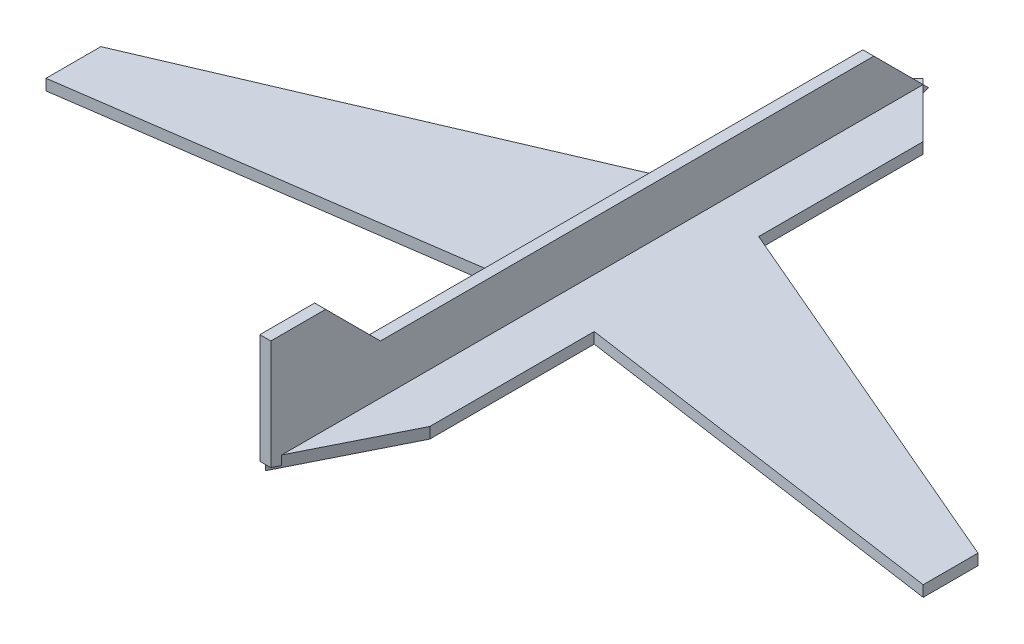
ISO-10303-21;
HEADER;
FILE_DESCRIPTION(('STEP AP214'),'2;1');
FILE_NAME('part.step','',(''),(''),'','','');
FILE_SCHEMA(('AUTOMOTIVE_DESIGN { 1 0 10303 214 1 1 1 1 }'));
ENDSEC;
DATA;
#1=APPLICATION_CONTEXT('core data for automotive mechanical design processes');
#2=APPLICATION_PROTOCOL_DEFINITION('international standard','automotive_design',2000,#1);
#3=PRODUCT_CONTEXT('',#1,'mechanical');
#4=PRODUCT('Part','Part','',(#3));
#5=PRODUCT_RELATED_PRODUCT_CATEGORY('part','',(#4));
#6=PRODUCT_DEFINITION_FORMATION('','',#4);
#7=PRODUCT_DEFINITION_CONTEXT('part definition',#1,'design');
#8=PRODUCT_DEFINITION('design','',#6,#7);
#9=PRODUCT_DEFINITION_SHAPE('','',#8);
#10=(LENGTH_UNIT() NAMED_UNIT(*) SI_UNIT(.MILLI.,.METRE.));
#11=(NAMED_UNIT(*) PLANE_ANGLE_UNIT() SI_UNIT($,.RADIAN.));
#12=(NAMED_UNIT(*) SI_UNIT($,.STERADIAN.) SOLID_ANGLE_UNIT());
#13=UNCERTAINTY_MEASURE_WITH_UNIT(LENGTH_MEASURE(1.E-05),#10,'distance_accuracy_value','');
#14=(GEOMETRIC_REPRESENTATION_CONTEXT(3) GLOBAL_UNCERTAINTY_ASSIGNED_CONTEXT((#13)) GLOBAL_UNIT_ASSIGNED_CONTEXT((#10,
#11,#12)) REPRESENTATION_CONTEXT('',''));
#15=CARTESIAN_POINT('',(0.,0.,0.));
#16=DIRECTION('',(0.,0.,1.));
#17=DIRECTION('',(1.,0.,0.));
#18=AXIS2_PLACEMENT_3D('',#15,#16,#17);
#19=CARTESIAN_POINT('',(-2.5,-0.1,-2.5));
#20=DIRECTION('',(-0.707106781186548,0.,-0.707106781186547));
#21=DIRECTION('',(-0.707106781186547,0.,0.707106781186548));
#22=AXIS2_PLACEMENT_3D('',#19,#20,#21);
#23=PLANE('',#22);
#24=DIRECTION('',(-0.688247201611685,-0.229415733870562,0.688247201611686));
#25=VECTOR('',#24,1.);
#26=CARTESIAN_POINT('',(-2.38421052631579,-0.794736842105264,-2.61578947368421));
#27=LINE('',#26,#25);
#28=CARTESIAN_POINT('',(0.,0.,-5.));
#29=VERTEX_POINT('',#28);
#30=CARTESIAN_POINT('',(-0.0999999999999999,-0.0333333333333336,-4.9));
#31=VERTEX_POINT('',#30);
#32=EDGE_CURVE('E334',#29,#31,#27,.T.);
#33=ORIENTED_EDGE('',*,*,#32,.F.);
#34=DIRECTION('',(0.,1.,0.));
#35=VECTOR('',#34,1.);
#36=CARTESIAN_POINT('',(0.,-0.1,-5.));
#37=LINE('',#36,#35);
#38=CARTESIAN_POINT('',(0.,-0.1,-5.));
#39=VERTEX_POINT('',#38);
#40=EDGE_CURVE('E50',#39,#29,#37,.T.);
#41=ORIENTED_EDGE('',*,*,#40,.F.);
#42=DIRECTION('',(-0.707106781186547,0.,0.707106781186548));
#43=VECTOR('',#42,1.);
#44=CARTESIAN_POINT('',(-2.5,-0.1,-2.5));
#45=LINE('',#44,#43);
#46=CARTESIAN_POINT('',(-0.999999999999999,-0.1,-4.));
#47=VERTEX_POINT('',#46);
#48=EDGE_CURVE('E379',#39,#47,#45,.T.);
#49=ORIENTED_EDGE('',*,*,#48,.T.);
#50=DIRECTION('',(0.,1.,0.));
#51=VECTOR('',#50,1.);
#52=CARTESIAN_POINT('',(-0.999999999999999,-0.1,-4.));
#53=LINE('',#52,#51);
#54=CARTESIAN_POINT('',(-0.999999999999999,0.1,-4.));
#55=VERTEX_POINT('',#54);
#56=EDGE_CURVE('E432',#47,#55,#53,.T.);
#57=ORIENTED_EDGE('',*,*,#56,.T.);
#58=DIRECTION('',(-0.707106781186547,0.,0.707106781186548));
#59=VECTOR('',#58,1.);
#60=CARTESIAN_POINT('',(-2.5,0.1,-2.5));
#61=LINE('',#60,#59);
#62=CARTESIAN_POINT('',(-0.1,0.1,-4.9));
#63=VERTEX_POINT('',#62);
#64=EDGE_CURVE('E343',#63,#55,#61,.T.);
#65=ORIENTED_EDGE('',*,*,#64,.F.);
#66=DIRECTION('',(0.,-1.,0.));
#67=VECTOR('',#66,1.);
#68=CARTESIAN_POINT('',(-0.0999999999999998,-0.1,-4.9));
#69=LINE('',#68,#67);
#70=EDGE_CURVE('E316',#63,#31,#69,.T.);
#71=ORIENTED_EDGE('',*,*,#70,.T.);
#72=EDGE_LOOP('',(#33,#41,#49,#57,#65,#71));
#73=FACE_BOUND('',#72,.T.);
#74=ADVANCED_FACE('F35',(#73),#23,.T.);
#75=CARTESIAN_POINT('',(2.5,-0.1,-2.5));
#76=DIRECTION('',(-0.707106781186548,0.,0.707106781186547));
#77=DIRECTION('',(0.707106781186547,0.,0.707106781186548));
#78=AXIS2_PLACEMENT_3D('',#75,#76,#77);
#79=PLANE('',#78);
#80=ORIENTED_EDGE('',*,*,#40,.T.);
#81=DIRECTION('',(0.688247201611685,-0.229415733870562,0.688247201611686));
#82=VECTOR('',#81,1.);
#83=CARTESIAN_POINT('',(2.38421052631579,-0.794736842105264,-2.61578947368421));
#84=LINE('',#83,#82);
#85=CARTESIAN_POINT('',(0.0999999999999999,-0.0333333333333336,-4.9));
#86=VERTEX_POINT('',#85);
#87=EDGE_CURVE('E230',#29,#86,#84,.T.);
#88=ORIENTED_EDGE('',*,*,#87,.T.);
#89=DIRECTION('',(0.,1.,0.));
#90=VECTOR('',#89,1.);
#91=CARTESIAN_POINT('',(0.0999999999999998,-0.1,-4.9));
#92=LINE('',#91,#90);
#93=CARTESIAN_POINT('',(0.1,0.1,-4.9));
#94=VERTEX_POINT('',#93);
#95=EDGE_CURVE('E240',#86,#94,#92,.T.);
#96=ORIENTED_EDGE('',*,*,#95,.T.);
#97=DIRECTION('',(0.707106781186547,0.,0.707106781186548));
#98=VECTOR('',#97,1.);
#99=CARTESIAN_POINT('',(2.5,0.1,-2.5));
#100=LINE('',#99,#98);
#101=CARTESIAN_POINT('',(1.,0.1,-4.));
#102=VERTEX_POINT('',#101);
#103=EDGE_CURVE('E339',#94,#102,#100,.T.);
#104=ORIENTED_EDGE('',*,*,#103,.T.);
#105=DIRECTION('',(0.,1.,0.));
#106=VECTOR('',#105,1.);
#107=CARTESIAN_POINT('',(1.,-0.1,-4.));
#108=LINE('',#107,#106);
#109=CARTESIAN_POINT('',(1.,-0.1,-4.));
#110=VERTEX_POINT('',#109);
#111=EDGE_CURVE('E405',#110,#102,#108,.T.);
#112=ORIENTED_EDGE('',*,*,#111,.F.);
#113=DIRECTION('',(0.707106781186547,0.,0.707106781186548));
#114=VECTOR('',#113,1.);
#115=CARTESIAN_POINT('',(2.5,-0.1,-2.5));
#116=LINE('',#115,#114);
#117=EDGE_CURVE('E376',#39,#110,#116,.T.);
#118=ORIENTED_EDGE('',*,*,#117,.F.);
#119=EDGE_LOOP('',(#80,#88,#96,#104,#112,#118));
#120=FACE_BOUND('',#119,.T.);
#121=ADVANCED_FACE('F488',(#120),#79,.F.);
#122=CARTESIAN_POINT('',(0.,-0.1,0.));
#123=DIRECTION('',(0.,1.,0.));
#124=DIRECTION('',(0.,0.,1.));
#125=AXIS2_PLACEMENT_3D('',#122,#123,#124);
#126=PLANE('',#125);
#127=DIRECTION('',(0.,0.,1.));
#128=VECTOR('',#127,1.);
#129=CARTESIAN_POINT('',(1.,-0.1,0.));
#130=LINE('',#129,#128);
#131=CARTESIAN_POINT('',(1.,-0.1,-1.));
#132=VERTEX_POINT('',#131);
#133=EDGE_CURVE('E373',#110,#132,#130,.T.);
#134=ORIENTED_EDGE('',*,*,#133,.T.);
#135=DIRECTION('',(0.919145030018058,0.,0.393919298579168));
#136=VECTOR('',#135,1.);
#137=CARTESIAN_POINT('',(0.517241379310345,-0.1,-1.20689655172414));
#138=LINE('',#137,#136);
#139=CARTESIAN_POINT('',(8.,-0.1,2.));
#140=VERTEX_POINT('',#139);
#141=EDGE_CURVE('E403',#132,#140,#138,.T.);
#142=ORIENTED_EDGE('',*,*,#141,.T.);
#143=DIRECTION('',(0.,0.,1.));
#144=VECTOR('',#143,1.);
#145=CARTESIAN_POINT('',(8.,-0.1,0.));
#146=LINE('',#145,#144);
#147=CARTESIAN_POINT('',(8.,-0.1,3.));
#148=VERTEX_POINT('',#147);
#149=EDGE_CURVE('E401',#140,#148,#146,.T.);
#150=ORIENTED_EDGE('',*,*,#149,.T.);
#151=DIRECTION('',(-0.989949493661167,0.,-0.14142135623731));
#152=VECTOR('',#151,1.);
#153=CARTESIAN_POINT('',(-0.26,-0.1,1.82));
#154=LINE('',#153,#152);
#155=CARTESIAN_POINT('',(1.,-0.1,2.));
#156=VERTEX_POINT('',#155);
#157=EDGE_CURVE('E399',#148,#156,#154,.T.);
#158=ORIENTED_EDGE('',*,*,#157,.T.);
#159=CARTESIAN_POINT('',(1.,-0.1,5.));
#160=VERTEX_POINT('',#159);
#161=EDGE_CURVE('E377',#156,#160,#130,.T.);
#162=ORIENTED_EDGE('',*,*,#161,.T.);
#163=DIRECTION('',(0.447213595499958,0.,-0.894427190999916));
#164=VECTOR('',#163,1.);
#165=CARTESIAN_POINT('',(2.8,-0.1,1.4));
#166=LINE('',#165,#164);
#167=CARTESIAN_POINT('',(0.,-0.1,7.));
#168=VERTEX_POINT('',#167);
#169=EDGE_CURVE('E396',#168,#160,#166,.T.);
#170=ORIENTED_EDGE('',*,*,#169,.F.);
#171=DIRECTION('',(-0.447213595499958,0.,-0.894427190999916));
#172=VECTOR('',#171,1.);
#173=CARTESIAN_POINT('',(-2.8,-0.1,1.4));
#174=LINE('',#173,#172);
#175=CARTESIAN_POINT('',(-1.,-0.1,5.));
#176=VERTEX_POINT('',#175);
#177=EDGE_CURVE('E394',#168,#176,#174,.T.);
#178=ORIENTED_EDGE('',*,*,#177,.T.);
#179=DIRECTION('',(0.,0.,-1.));
#180=VECTOR('',#179,1.);
#181=CARTESIAN_POINT('',(-1.,-0.1,0.));
#182=LINE('',#181,#180);
#183=CARTESIAN_POINT('',(-1.,-0.1,2.));
#184=VERTEX_POINT('',#183);
#185=EDGE_CURVE('E385',#176,#184,#182,.T.);
#186=ORIENTED_EDGE('',*,*,#185,.T.);
#187=DIRECTION('',(0.989949493661167,0.,-0.14142135623731));
#188=VECTOR('',#187,1.);
#189=CARTESIAN_POINT('',(0.26,-0.1,1.82));
#190=LINE('',#189,#188);
#191=CARTESIAN_POINT('',(-8.,-0.1,3.));
#192=VERTEX_POINT('',#191);
#193=EDGE_CURVE('E391',#192,#184,#190,.T.);
#194=ORIENTED_EDGE('',*,*,#193,.F.);
#195=DIRECTION('',(0.,0.,1.));
#196=VECTOR('',#195,1.);
#197=CARTESIAN_POINT('',(-8.,-0.1,0.));
#198=LINE('',#197,#196);
#199=CARTESIAN_POINT('',(-8.,-0.1,2.));
#200=VERTEX_POINT('',#199);
#201=EDGE_CURVE('E388',#200,#192,#198,.T.);
#202=ORIENTED_EDGE('',*,*,#201,.F.);
#203=DIRECTION('',(-0.919145030018058,0.,0.393919298579168));
#204=VECTOR('',#203,1.);
#205=CARTESIAN_POINT('',(-0.517241379310345,-0.1,-1.20689655172414));
#206=LINE('',#205,#204);
#207=CARTESIAN_POINT('',(-1.,-0.1,-1.));
#208=VERTEX_POINT('',#207);
#209=EDGE_CURVE('E384',#208,#200,#206,.T.);
#210=ORIENTED_EDGE('',*,*,#209,.F.);
#211=EDGE_CURVE('E382',#208,#47,#182,.T.);
#212=ORIENTED_EDGE('',*,*,#211,.T.);
#213=ORIENTED_EDGE('',*,*,#48,.F.);
#214=ORIENTED_EDGE('',*,*,#117,.T.);
#215=EDGE_LOOP('',(#134,#142,#150,#158,#162,#170,#178,#186,#194,#202,#210,#212,#213,#214));
#216=FACE_BOUND('',#215,.T.);
#217=DIRECTION('',(0.,0.,-1.));
#218=VECTOR('',#217,1.);
#219=CARTESIAN_POINT('',(-0.1,-0.1,0.));
#220=LINE('',#219,#218);
#221=CARTESIAN_POINT('',(-0.1,-0.1,6.7));
#222=VERTEX_POINT('',#221);
#223=CARTESIAN_POINT('',(-0.1,-0.1,-4.7));
#224=VERTEX_POINT('',#223);
#225=EDGE_CURVE('E322',#222,#224,#220,.T.);
#226=ORIENTED_EDGE('',*,*,#225,.F.);
#227=DIRECTION('',(1.,0.,0.));
#228=VECTOR('',#227,1.);
#229=CARTESIAN_POINT('',(0.,-0.1,6.7));
#230=LINE('',#229,#228);
#231=CARTESIAN_POINT('',(0.1,-0.1,6.7));
#232=VERTEX_POINT('',#231);
#233=EDGE_CURVE('E43',#222,#232,#230,.T.);
#234=ORIENTED_EDGE('',*,*,#233,.T.);
#235=DIRECTION('',(0.,0.,-1.));
#236=VECTOR('',#235,1.);
#237=CARTESIAN_POINT('',(0.1,-0.1,0.));
#238=LINE('',#237,#236);
#239=CARTESIAN_POINT('',(0.1,-0.1,-4.7));
#240=VERTEX_POINT('',#239);
#241=EDGE_CURVE('E313',#232,#240,#238,.T.);
#242=ORIENTED_EDGE('',*,*,#241,.T.);
#243=DIRECTION('',(-1.,0.,0.));
#244=VECTOR('',#243,1.);
#245=CARTESIAN_POINT('',(0.,-0.1,-4.7));
#246=LINE('',#245,#244);
#247=EDGE_CURVE('E11',#240,#224,#246,.T.);
#248=ORIENTED_EDGE('',*,*,#247,.T.);
#249=EDGE_LOOP('',(#226,#234,#242,#248));
#250=FACE_BOUND('',#249,.T.);
#251=ADVANCED_FACE('F449',(#216,#250),#126,.F.);
#252=CARTESIAN_POINT('',(0.,0.1,0.));
#253=DIRECTION('',(0.,1.,0.));
#254=DIRECTION('',(0.,0.,1.));
#255=AXIS2_PLACEMENT_3D('',#252,#253,#254);
#256=PLANE('',#255);
#257=DIRECTION('',(-0.447213595499958,0.,-0.894427190999916));
#258=VECTOR('',#257,1.);
#259=CARTESIAN_POINT('',(-2.8,0.1,1.4));
#260=LINE('',#259,#258);
#261=CARTESIAN_POINT('',(-0.1,0.1,6.8));
#262=VERTEX_POINT('',#261);
#263=CARTESIAN_POINT('',(-1.,0.1,5.));
#264=VERTEX_POINT('',#263);
#265=EDGE_CURVE('E360',#262,#264,#260,.T.);
#266=ORIENTED_EDGE('',*,*,#265,.F.);
#267=DIRECTION('',(0.,0.,-1.));
#268=VECTOR('',#267,1.);
#269=CARTESIAN_POINT('',(-0.1,0.1,0.));
#270=LINE('',#269,#268);
#271=EDGE_CURVE('E444',#262,#63,#270,.T.);
#272=ORIENTED_EDGE('',*,*,#271,.T.);
#273=ORIENTED_EDGE('',*,*,#64,.T.);
#274=DIRECTION('',(0.,0.,-1.));
#275=VECTOR('',#274,1.);
#276=CARTESIAN_POINT('',(-1.,0.1,0.));
#277=LINE('',#276,#275);
#278=CARTESIAN_POINT('',(-1.,0.1,-1.));
#279=VERTEX_POINT('',#278);
#280=EDGE_CURVE('E347',#279,#55,#277,.T.);
#281=ORIENTED_EDGE('',*,*,#280,.F.);
#282=DIRECTION('',(-0.919145030018058,0.,0.393919298579168));
#283=VECTOR('',#282,1.);
#284=CARTESIAN_POINT('',(-0.517241379310345,0.1,-1.20689655172414));
#285=LINE('',#284,#283);
#286=CARTESIAN_POINT('',(-8.,0.1,2.));
#287=VERTEX_POINT('',#286);
#288=EDGE_CURVE('E350',#279,#287,#285,.T.);
#289=ORIENTED_EDGE('',*,*,#288,.T.);
#290=DIRECTION('',(0.,0.,1.));
#291=VECTOR('',#290,1.);
#292=CARTESIAN_POINT('',(-8.,0.1,0.));
#293=LINE('',#292,#291);
#294=CARTESIAN_POINT('',(-8.,0.1,3.));
#295=VERTEX_POINT('',#294);
#296=EDGE_CURVE('E354',#287,#295,#293,.T.);
#297=ORIENTED_EDGE('',*,*,#296,.T.);
#298=DIRECTION('',(0.989949493661167,0.,-0.14142135623731));
#299=VECTOR('',#298,1.);
#300=CARTESIAN_POINT('',(0.26,0.1,1.82));
#301=LINE('',#300,#299);
#302=CARTESIAN_POINT('',(-1.,0.1,2.));
#303=VERTEX_POINT('',#302);
#304=EDGE_CURVE('E357',#295,#303,#301,.T.);
#305=ORIENTED_EDGE('',*,*,#304,.T.);
#306=EDGE_CURVE('E351',#264,#303,#277,.T.);
#307=ORIENTED_EDGE('',*,*,#306,.F.);
#308=EDGE_LOOP('',(#266,#272,#273,#281,#289,#297,#305,#307));
#309=FACE_BOUND('',#308,.T.);
#310=ADVANCED_FACE('F517',(#309),#256,.T.);
#311=CARTESIAN_POINT('',(1.,-0.1,0.));
#312=DIRECTION('',(-1.,0.,0.));
#313=DIRECTION('',(0.,0.,1.));
#314=AXIS2_PLACEMENT_3D('',#311,#312,#313);
#315=PLANE('',#314);
#316=ORIENTED_EDGE('',*,*,#111,.T.);
#317=DIRECTION('',(0.,0.,1.));
#318=VECTOR('',#317,1.);
#319=CARTESIAN_POINT('',(1.,0.1,0.));
#320=LINE('',#319,#318);
#321=CARTESIAN_POINT('',(1.,0.1,-1.));
#322=VERTEX_POINT('',#321);
#323=EDGE_CURVE('E336',#102,#322,#320,.T.);
#324=ORIENTED_EDGE('',*,*,#323,.T.);
#325=DIRECTION('',(0.,1.,0.));
#326=VECTOR('',#325,1.);
#327=CARTESIAN_POINT('',(1.,-0.1,-1.));
#328=LINE('',#327,#326);
#329=EDGE_CURVE('E406',#132,#322,#328,.T.);
#330=ORIENTED_EDGE('',*,*,#329,.F.);
#331=ORIENTED_EDGE('',*,*,#133,.F.);
#332=EDGE_LOOP('',(#316,#324,#330,#331));
#333=FACE_BOUND('',#332,.T.);
#334=ADVANCED_FACE('F706',(#333),#315,.F.);
#335=CARTESIAN_POINT('',(0.517241379310345,-0.1,-1.20689655172414));
#336=DIRECTION('',(-0.393919298579168,0.,0.919145030018058));
#337=DIRECTION('',(0.919145030018058,0.,0.393919298579168));
#338=AXIS2_PLACEMENT_3D('',#335,#336,#337);
#339=PLANE('',#338);
#340=ORIENTED_EDGE('',*,*,#329,.T.);
#341=DIRECTION('',(0.919145030018058,0.,0.393919298579168));
#342=VECTOR('',#341,1.);
#343=CARTESIAN_POINT('',(0.517241379310345,0.1,-1.20689655172414));
#344=LINE('',#343,#342);
#345=CARTESIAN_POINT('',(8.,0.1,2.));
#346=VERTEX_POINT('',#345);
#347=EDGE_CURVE('E370',#322,#346,#344,.T.);
#348=ORIENTED_EDGE('',*,*,#347,.T.);
#349=DIRECTION('',(0.,1.,0.));
#350=VECTOR('',#349,1.);
#351=CARTESIAN_POINT('',(8.,-0.1,2.));
#352=LINE('',#351,#350);
#353=EDGE_CURVE('E409',#140,#346,#352,.T.);
#354=ORIENTED_EDGE('',*,*,#353,.F.);
#355=ORIENTED_EDGE('',*,*,#141,.F.);
#356=EDGE_LOOP('',(#340,#348,#354,#355));
#357=FACE_BOUND('',#356,.T.);
#358=ADVANCED_FACE('F802',(#357),#339,.F.);
#359=CARTESIAN_POINT('',(8.,-0.1,0.));
#360=DIRECTION('',(-1.,0.,0.));
#361=DIRECTION('',(0.,0.,1.));
#362=AXIS2_PLACEMENT_3D('',#359,#360,#361);
#363=PLANE('',#362);
#364=ORIENTED_EDGE('',*,*,#353,.T.);
#365=DIRECTION('',(0.,0.,1.));
#366=VECTOR('',#365,1.);
#367=CARTESIAN_POINT('',(8.,0.1,0.));
#368=LINE('',#367,#366);
#369=CARTESIAN_POINT('',(8.,0.1,3.));
#370=VERTEX_POINT('',#369);
#371=EDGE_CURVE('E367',#346,#370,#368,.T.);
#372=ORIENTED_EDGE('',*,*,#371,.T.);
#373=DIRECTION('',(0.,1.,0.));
#374=VECTOR('',#373,1.);
#375=CARTESIAN_POINT('',(8.,-0.1,3.));
#376=LINE('',#375,#374);
#377=EDGE_CURVE('E411',#148,#370,#376,.T.);
#378=ORIENTED_EDGE('',*,*,#377,.F.);
#379=ORIENTED_EDGE('',*,*,#149,.F.);
#380=EDGE_LOOP('',(#364,#372,#378,#379));
#381=FACE_BOUND('',#380,.T.);
#382=ADVANCED_FACE('F791',(#381),#363,.F.);
#383=CARTESIAN_POINT('',(-0.26,-0.1,1.82));
#384=DIRECTION('',(0.141421356237309,0.,-0.989949493661166));
#385=DIRECTION('',(-0.989949493661167,0.,-0.14142135623731));
#386=AXIS2_PLACEMENT_3D('',#383,#384,#385);
#387=PLANE('',#386);
#388=ORIENTED_EDGE('',*,*,#377,.T.);
#389=DIRECTION('',(-0.989949493661167,0.,-0.14142135623731));
#390=VECTOR('',#389,1.);
#391=CARTESIAN_POINT('',(-0.26,0.1,1.82));
#392=LINE('',#391,#390);
#393=CARTESIAN_POINT('',(1.,0.1,2.));
#394=VERTEX_POINT('',#393);
#395=EDGE_CURVE('E364',#370,#394,#392,.T.);
#396=ORIENTED_EDGE('',*,*,#395,.T.);
#397=DIRECTION('',(0.,1.,0.));
#398=VECTOR('',#397,1.);
#399=CARTESIAN_POINT('',(1.,-0.1,2.));
#400=LINE('',#399,#398);
#401=EDGE_CURVE('E413',#156,#394,#400,.T.);
#402=ORIENTED_EDGE('',*,*,#401,.F.);
#403=ORIENTED_EDGE('',*,*,#157,.F.);
#404=EDGE_LOOP('',(#388,#396,#402,#403));
#405=FACE_BOUND('',#404,.T.);
#406=ADVANCED_FACE('F780',(#405),#387,.F.);
#407=ORIENTED_EDGE('',*,*,#401,.T.);
#408=CARTESIAN_POINT('',(1.,0.1,5.));
#409=VERTEX_POINT('',#408);
#410=EDGE_CURVE('E340',#394,#409,#320,.T.);
#411=ORIENTED_EDGE('',*,*,#410,.T.);
#412=DIRECTION('',(0.,1.,0.));
#413=VECTOR('',#412,1.);
#414=CARTESIAN_POINT('',(1.,-0.1,5.));
#415=LINE('',#414,#413);
#416=EDGE_CURVE('E415',#160,#409,#415,.T.);
#417=ORIENTED_EDGE('',*,*,#416,.F.);
#418=ORIENTED_EDGE('',*,*,#161,.F.);
#419=EDGE_LOOP('',(#407,#411,#417,#418));
#420=FACE_BOUND('',#419,.T.);
#421=ADVANCED_FACE('F695',(#420),#315,.F.);
#422=CARTESIAN_POINT('',(2.8,-0.1,1.4));
#423=DIRECTION('',(0.894427190999916,0.,0.447213595499958));
#424=DIRECTION('',(0.447213595499958,0.,-0.894427190999916));
#425=AXIS2_PLACEMENT_3D('',#422,#423,#424);
#426=PLANE('',#425);
#427=DIRECTION('',(0.428571428571429,-0.285714285714286,-0.857142857142857));
#428=VECTOR('',#427,1.);
#429=CARTESIAN_POINT('',(2.58367346938776,-1.72244897959184,1.83265306122449));
#430=LINE('',#429,#428);
#431=CARTESIAN_POINT('',(0.,0.,7.));
#432=VERTEX_POINT('',#431);
#433=CARTESIAN_POINT('',(0.0999999999999999,-0.0666666666666664,6.8));
#434=VERTEX_POINT('',#433);
#435=EDGE_CURVE('E330',#432,#434,#430,.T.);
#436=ORIENTED_EDGE('',*,*,#435,.F.);
#437=DIRECTION('',(0.,1.,0.));
#438=VECTOR('',#437,1.);
#439=CARTESIAN_POINT('',(0.,-0.1,7.));
#440=LINE('',#439,#438);
#441=EDGE_CURVE('E418',#168,#432,#440,.T.);
#442=ORIENTED_EDGE('',*,*,#441,.F.);
#443=ORIENTED_EDGE('',*,*,#169,.T.);
#444=ORIENTED_EDGE('',*,*,#416,.T.);
#445=DIRECTION('',(0.447213595499958,0.,-0.894427190999916));
#446=VECTOR('',#445,1.);
#447=CARTESIAN_POINT('',(2.8,0.1,1.4));
#448=LINE('',#447,#446);
#449=CARTESIAN_POINT('',(0.1,0.1,6.8));
#450=VERTEX_POINT('',#449);
#451=EDGE_CURVE('E362',#450,#409,#448,.T.);
#452=ORIENTED_EDGE('',*,*,#451,.F.);
#453=DIRECTION('',(0.,1.,0.));
#454=VECTOR('',#453,1.);
#455=CARTESIAN_POINT('',(0.0999999999999998,-0.1,6.8));
#456=LINE('',#455,#454);
#457=EDGE_CURVE('E310',#434,#450,#456,.T.);
#458=ORIENTED_EDGE('',*,*,#457,.F.);
#459=EDGE_LOOP('',(#436,#442,#443,#444,#452,#458));
#460=FACE_BOUND('',#459,.T.);
#461=ADVANCED_FACE('F551',(#460),#426,.T.);
#462=CARTESIAN_POINT('',(-2.8,-0.1,1.4));
#463=DIRECTION('',(0.894427190999916,0.,-0.447213595499958));
#464=DIRECTION('',(-0.447213595499958,0.,-0.894427190999916));
#465=AXIS2_PLACEMENT_3D('',#462,#463,#464);
#466=PLANE('',#465);
#467=ORIENTED_EDGE('',*,*,#441,.T.);
#468=DIRECTION('',(-0.428571428571429,-0.285714285714286,-0.857142857142857));
#469=VECTOR('',#468,1.);
#470=CARTESIAN_POINT('',(-2.58367346938776,-1.72244897959184,1.83265306122449));
#471=LINE('',#470,#469);
#472=CARTESIAN_POINT('',(-0.0999999999999999,-0.0666666666666664,6.8));
#473=VERTEX_POINT('',#472);
#474=EDGE_CURVE('E328',#432,#473,#471,.T.);
#475=ORIENTED_EDGE('',*,*,#474,.T.);
#476=DIRECTION('',(0.,-1.,0.));
#477=VECTOR('',#476,1.);
#478=CARTESIAN_POINT('',(-0.0999999999999998,-0.1,6.8));
#479=LINE('',#478,#477);
#480=EDGE_CURVE('E319',#262,#473,#479,.T.);
#481=ORIENTED_EDGE('',*,*,#480,.F.);
#482=ORIENTED_EDGE('',*,*,#265,.T.);
#483=DIRECTION('',(0.,1.,0.));
#484=VECTOR('',#483,1.);
#485=CARTESIAN_POINT('',(-1.,-0.1,5.));
#486=LINE('',#485,#484);
#487=EDGE_CURVE('E421',#176,#264,#486,.T.);
#488=ORIENTED_EDGE('',*,*,#487,.F.);
#489=ORIENTED_EDGE('',*,*,#177,.F.);
#490=EDGE_LOOP('',(#467,#475,#481,#482,#488,#489));
#491=FACE_BOUND('',#490,.T.);
#492=ADVANCED_FACE('F556',(#491),#466,.F.);
#493=CARTESIAN_POINT('',(-1.,-0.1,0.));
#494=DIRECTION('',(1.,0.,0.));
#495=DIRECTION('',(0.,0.,-1.));
#496=AXIS2_PLACEMENT_3D('',#493,#494,#495);
#497=PLANE('',#496);
#498=ORIENTED_EDGE('',*,*,#487,.T.);
#499=ORIENTED_EDGE('',*,*,#306,.T.);
#500=DIRECTION('',(0.,1.,0.));
#501=VECTOR('',#500,1.);
#502=CARTESIAN_POINT('',(-1.,-0.1,2.));
#503=LINE('',#502,#501);
#504=EDGE_CURVE('E424',#184,#303,#503,.T.);
#505=ORIENTED_EDGE('',*,*,#504,.F.);
#506=ORIENTED_EDGE('',*,*,#185,.F.);
#507=EDGE_LOOP('',(#498,#499,#505,#506));
#508=FACE_BOUND('',#507,.T.);
#509=ADVANCED_FACE('F684',(#508),#497,.F.);
#510=CARTESIAN_POINT('',(0.26,-0.1,1.82));
#511=DIRECTION('',(0.141421356237309,0.,0.989949493661166));
#512=DIRECTION('',(0.989949493661167,0.,-0.14142135623731));
#513=AXIS2_PLACEMENT_3D('',#510,#511,#512);
#514=PLANE('',#513);
#515=ORIENTED_EDGE('',*,*,#504,.T.);
#516=ORIENTED_EDGE('',*,*,#304,.F.);
#517=DIRECTION('',(0.,1.,0.));
#518=VECTOR('',#517,1.);
#519=CARTESIAN_POINT('',(-8.,-0.1,3.));
#520=LINE('',#519,#518);
#521=EDGE_CURVE('E426',#192,#295,#520,.T.);
#522=ORIENTED_EDGE('',*,*,#521,.F.);
#523=ORIENTED_EDGE('',*,*,#193,.T.);
#524=EDGE_LOOP('',(#515,#516,#522,#523));
#525=FACE_BOUND('',#524,.T.);
#526=ADVANCED_FACE('F755',(#525),#514,.T.);
#527=CARTESIAN_POINT('',(-8.,-0.1,0.));
#528=DIRECTION('',(-1.,0.,0.));
#529=DIRECTION('',(0.,0.,1.));
#530=AXIS2_PLACEMENT_3D('',#527,#528,#529);
#531=PLANE('',#530);
#532=ORIENTED_EDGE('',*,*,#521,.T.);
#533=ORIENTED_EDGE('',*,*,#296,.F.);
#534=DIRECTION('',(0.,1.,0.));
#535=VECTOR('',#534,1.);
#536=CARTESIAN_POINT('',(-8.,-0.1,2.));
#537=LINE('',#536,#535);
#538=EDGE_CURVE('E428',#200,#287,#537,.T.);
#539=ORIENTED_EDGE('',*,*,#538,.F.);
#540=ORIENTED_EDGE('',*,*,#201,.T.);
#541=EDGE_LOOP('',(#532,#533,#539,#540));
#542=FACE_BOUND('',#541,.T.);
#543=ADVANCED_FACE('F745',(#542),#531,.T.);
#544=CARTESIAN_POINT('',(-0.517241379310345,-0.1,-1.20689655172414));
#545=DIRECTION('',(-0.393919298579168,0.,-0.919145030018058));
#546=DIRECTION('',(-0.919145030018058,0.,0.393919298579168));
#547=AXIS2_PLACEMENT_3D('',#544,#545,#546);
#548=PLANE('',#547);
#549=ORIENTED_EDGE('',*,*,#538,.T.);
#550=ORIENTED_EDGE('',*,*,#288,.F.);
#551=DIRECTION('',(0.,1.,0.));
#552=VECTOR('',#551,1.);
#553=CARTESIAN_POINT('',(-1.,-0.1,-1.));
#554=LINE('',#553,#552);
#555=EDGE_CURVE('E430',#208,#279,#554,.T.);
#556=ORIENTED_EDGE('',*,*,#555,.F.);
#557=ORIENTED_EDGE('',*,*,#209,.T.);
#558=EDGE_LOOP('',(#549,#550,#556,#557));
#559=FACE_BOUND('',#558,.T.);
#560=ADVANCED_FACE('F734',(#559),#548,.T.);
#561=ORIENTED_EDGE('',*,*,#555,.T.);
#562=ORIENTED_EDGE('',*,*,#280,.T.);
#563=ORIENTED_EDGE('',*,*,#56,.F.);
#564=ORIENTED_EDGE('',*,*,#211,.F.);
#565=EDGE_LOOP('',(#561,#562,#563,#564));
#566=FACE_BOUND('',#565,.T.);
#567=ADVANCED_FACE('F672',(#566),#497,.F.);
#568=DIRECTION('',(0.,0.,-1.));
#569=VECTOR('',#568,1.);
#570=CARTESIAN_POINT('',(0.1,0.1,0.));
#571=LINE('',#570,#569);
#572=EDGE_CURVE('E408',#450,#94,#571,.T.);
#573=ORIENTED_EDGE('',*,*,#572,.F.);
#574=ORIENTED_EDGE('',*,*,#451,.T.);
#575=ORIENTED_EDGE('',*,*,#410,.F.);
#576=ORIENTED_EDGE('',*,*,#395,.F.);
#577=ORIENTED_EDGE('',*,*,#371,.F.);
#578=ORIENTED_EDGE('',*,*,#347,.F.);
#579=ORIENTED_EDGE('',*,*,#323,.F.);
#580=ORIENTED_EDGE('',*,*,#103,.F.);
#581=EDGE_LOOP('',(#573,#574,#575,#576,#577,#578,#579,#580));
#582=FACE_BOUND('',#581,.T.);
#583=ADVANCED_FACE('F569',(#582),#256,.T.);
#584=CARTESIAN_POINT('',(-0.1,0.,7.));
#585=DIRECTION('',(0.,0.,1.));
#586=DIRECTION('',(1.,0.,0.));
#587=AXIS2_PLACEMENT_3D('',#584,#585,#586);
#588=PLANE('',#587);
#589=DIRECTION('',(1.,0.,0.));
#590=VECTOR('',#589,1.);
#591=CARTESIAN_POINT('',(-0.1,0.,7.));
#592=LINE('',#591,#590);
#593=CARTESIAN_POINT('',(-0.1,0.,7.));
#594=VERTEX_POINT('',#593);
#595=EDGE_CURVE('E296',#594,#432,#592,.T.);
#596=ORIENTED_EDGE('',*,*,#595,.T.);
#597=CARTESIAN_POINT('',(0.1,0.,7.));
#598=VERTEX_POINT('',#597);
#599=EDGE_CURVE('E299',#432,#598,#592,.T.);
#600=ORIENTED_EDGE('',*,*,#599,.T.);
#601=DIRECTION('',(0.,-1.,0.));
#602=VECTOR('',#601,1.);
#603=CARTESIAN_POINT('',(0.1,0.,7.));
#604=LINE('',#603,#602);
#605=CARTESIAN_POINT('',(0.1,2.,7.));
#606=VERTEX_POINT('',#605);
#607=EDGE_CURVE('E256',#606,#598,#604,.T.);
#608=ORIENTED_EDGE('',*,*,#607,.F.);
#609=DIRECTION('',(1.,0.,0.));
#610=VECTOR('',#609,1.);
#611=CARTESIAN_POINT('',(-0.1,2.,7.));
#612=LINE('',#611,#610);
#613=CARTESIAN_POINT('',(-0.1,2.,7.));
#614=VERTEX_POINT('',#613);
#615=EDGE_CURVE('E300',#614,#606,#612,.T.);
#616=ORIENTED_EDGE('',*,*,#615,.F.);
#617=DIRECTION('',(0.,-1.,0.));
#618=VECTOR('',#617,1.);
#619=CARTESIAN_POINT('',(-0.1,0.,7.));
#620=LINE('',#619,#618);
#621=EDGE_CURVE('E282',#614,#594,#620,.T.);
#622=ORIENTED_EDGE('',*,*,#621,.T.);
#623=EDGE_LOOP('',(#596,#600,#608,#616,#622));
#624=FACE_BOUND('',#623,.T.);
#625=ADVANCED_FACE('F545',(#624),#588,.T.);
#626=CARTESIAN_POINT('',(-0.1,2.,7.));
#627=DIRECTION('',(0.,1.,0.));
#628=DIRECTION('',(0.,0.,1.));
#629=AXIS2_PLACEMENT_3D('',#626,#627,#628);
#630=PLANE('',#629);
#631=ORIENTED_EDGE('',*,*,#615,.T.);
#632=DIRECTION('',(0.,0.,1.));
#633=VECTOR('',#632,1.);
#634=CARTESIAN_POINT('',(0.1,2.,7.));
#635=LINE('',#634,#633);
#636=CARTESIAN_POINT('',(0.1,2.,6.));
#637=VERTEX_POINT('',#636);
#638=EDGE_CURVE('E253',#637,#606,#635,.T.);
#639=ORIENTED_EDGE('',*,*,#638,.F.);
#640=DIRECTION('',(1.,0.,0.));
#641=VECTOR('',#640,1.);
#642=CARTESIAN_POINT('',(-0.1,2.,6.));
#643=LINE('',#642,#641);
#644=CARTESIAN_POINT('',(-0.1,2.,6.));
#645=VERTEX_POINT('',#644);
#646=EDGE_CURVE('E302',#645,#637,#643,.T.);
#647=ORIENTED_EDGE('',*,*,#646,.F.);
#648=DIRECTION('',(0.,0.,1.));
#649=VECTOR('',#648,1.);
#650=CARTESIAN_POINT('',(-0.1,2.,7.));
#651=LINE('',#650,#649);
#652=EDGE_CURVE('E279',#645,#614,#651,.T.);
#653=ORIENTED_EDGE('',*,*,#652,.T.);
#654=EDGE_LOOP('',(#631,#639,#647,#653));
#655=FACE_BOUND('',#654,.T.);
#656=ADVANCED_FACE('F541',(#655),#630,.T.);
#657=CARTESIAN_POINT('',(-0.1,2.,6.));
#658=DIRECTION('',(0.,0.707106781186548,-0.707106781186548));
#659=DIRECTION('',(0.,0.707106781186548,0.707106781186548));
#660=AXIS2_PLACEMENT_3D('',#657,#658,#659);
#661=PLANE('',#660);
#662=ORIENTED_EDGE('',*,*,#646,.T.);
#663=DIRECTION('',(0.,0.707106781186548,0.707106781186548));
#664=VECTOR('',#663,1.);
#665=CARTESIAN_POINT('',(0.1,2.,6.));
#666=LINE('',#665,#664);
#667=CARTESIAN_POINT('',(0.1,1.,5.));
#668=VERTEX_POINT('',#667);
#669=EDGE_CURVE('E248',#668,#637,#666,.T.);
#670=ORIENTED_EDGE('',*,*,#669,.F.);
#671=DIRECTION('',(1.,0.,0.));
#672=VECTOR('',#671,1.);
#673=CARTESIAN_POINT('',(-0.1,1.,5.));
#674=LINE('',#673,#672);
#675=CARTESIAN_POINT('',(-0.1,1.,5.));
#676=VERTEX_POINT('',#675);
#677=EDGE_CURVE('E304',#676,#668,#674,.T.);
#678=ORIENTED_EDGE('',*,*,#677,.F.);
#679=DIRECTION('',(0.,0.707106781186548,0.707106781186548));
#680=VECTOR('',#679,1.);
#681=CARTESIAN_POINT('',(-0.1,2.,6.));
#682=LINE('',#681,#680);
#683=EDGE_CURVE('E276',#676,#645,#682,.T.);
#684=ORIENTED_EDGE('',*,*,#683,.T.);
#685=EDGE_LOOP('',(#662,#670,#678,#684));
#686=FACE_BOUND('',#685,.T.);
#687=ADVANCED_FACE('F539',(#686),#661,.T.);
#688=CARTESIAN_POINT('',(-0.1,1.,-4.));
#689=DIRECTION('',(0.,1.,0.));
#690=DIRECTION('',(0.,0.,1.));
#691=AXIS2_PLACEMENT_3D('',#688,#689,#690);
#692=PLANE('',#691);
#693=ORIENTED_EDGE('',*,*,#677,.T.);
#694=DIRECTION('',(0.,0.,1.));
#695=VECTOR('',#694,1.);
#696=CARTESIAN_POINT('',(0.1,1.,-4.));
#697=LINE('',#696,#695);
#698=CARTESIAN_POINT('',(0.1,1.,-4.));
#699=VERTEX_POINT('',#698);
#700=EDGE_CURVE('E244',#699,#668,#697,.T.);
#701=ORIENTED_EDGE('',*,*,#700,.F.);
#702=DIRECTION('',(1.,0.,0.));
#703=VECTOR('',#702,1.);
#704=CARTESIAN_POINT('',(-0.1,1.,-4.));
#705=LINE('',#704,#703);
#706=CARTESIAN_POINT('',(-0.1,1.,-4.));
#707=VERTEX_POINT('',#706);
#708=EDGE_CURVE('E306',#707,#699,#705,.T.);
#709=ORIENTED_EDGE('',*,*,#708,.F.);
#710=DIRECTION('',(0.,0.,1.));
#711=VECTOR('',#710,1.);
#712=CARTESIAN_POINT('',(-0.1,1.,-4.));
#713=LINE('',#712,#711);
#714=EDGE_CURVE('E273',#707,#676,#713,.T.);
#715=ORIENTED_EDGE('',*,*,#714,.T.);
#716=EDGE_LOOP('',(#693,#701,#709,#715));
#717=FACE_BOUND('',#716,.T.);
#718=ADVANCED_FACE('F533',(#717),#692,.T.);
#719=CARTESIAN_POINT('',(-0.1,0.,0.));
#720=DIRECTION('',(1.,0.,0.));
#721=DIRECTION('',(0.,0.,-1.));
#722=AXIS2_PLACEMENT_3D('',#719,#720,#721);
#723=PLANE('',#722);
#724=ORIENTED_EDGE('',*,*,#271,.F.);
#725=ORIENTED_EDGE('',*,*,#480,.T.);
#726=DIRECTION('',(0.,-0.316227766016838,-0.948683298050514));
#727=VECTOR('',#726,1.);
#728=CARTESIAN_POINT('',(-0.1,-1.,4.));
#729=LINE('',#728,#727);
#730=EDGE_CURVE('E286',#594,#473,#729,.T.);
#731=ORIENTED_EDGE('',*,*,#730,.F.);
#732=ORIENTED_EDGE('',*,*,#621,.F.);
#733=ORIENTED_EDGE('',*,*,#652,.F.);
#734=ORIENTED_EDGE('',*,*,#683,.F.);
#735=ORIENTED_EDGE('',*,*,#714,.F.);
#736=DIRECTION('',(0.,0.707106781186548,0.707106781186547));
#737=VECTOR('',#736,1.);
#738=CARTESIAN_POINT('',(-0.1,0.,-5.));
#739=LINE('',#738,#737);
#740=EDGE_CURVE('E270',#63,#707,#739,.T.);
#741=ORIENTED_EDGE('',*,*,#740,.F.);
#742=EDGE_LOOP('',(#724,#725,#731,#732,#733,#734,#735,#741));
#743=FACE_BOUND('',#742,.T.);
#744=ADVANCED_FACE('F529',(#743),#723,.F.);
#745=CARTESIAN_POINT('',(0.1,0.,0.));
#746=DIRECTION('',(1.,0.,0.));
#747=DIRECTION('',(0.,0.,-1.));
#748=AXIS2_PLACEMENT_3D('',#745,#746,#747);
#749=PLANE('',#748);
#750=DIRECTION('',(0.,-0.316227766016838,-0.948683298050514));
#751=VECTOR('',#750,1.);
#752=CARTESIAN_POINT('',(0.1,-1.,4.));
#753=LINE('',#752,#751);
#754=EDGE_CURVE('E260',#598,#434,#753,.T.);
#755=ORIENTED_EDGE('',*,*,#754,.T.);
#756=ORIENTED_EDGE('',*,*,#457,.T.);
#757=ORIENTED_EDGE('',*,*,#572,.T.);
#758=DIRECTION('',(0.,0.707106781186548,0.707106781186547));
#759=VECTOR('',#758,1.);
#760=CARTESIAN_POINT('',(0.1,0.,-5.));
#761=LINE('',#760,#759);
#762=EDGE_CURVE('E245',#94,#699,#761,.T.);
#763=ORIENTED_EDGE('',*,*,#762,.T.);
#764=ORIENTED_EDGE('',*,*,#700,.T.);
#765=ORIENTED_EDGE('',*,*,#669,.T.);
#766=ORIENTED_EDGE('',*,*,#638,.T.);
#767=ORIENTED_EDGE('',*,*,#607,.T.);
#768=EDGE_LOOP('',(#755,#756,#757,#763,#764,#765,#766,#767));
#769=FACE_BOUND('',#768,.T.);
#770=ADVANCED_FACE('F476',(#769),#749,.T.);
#771=CARTESIAN_POINT('',(-0.1,0.,-5.));
#772=DIRECTION('',(0.,0.707106781186547,-0.707106781186548));
#773=DIRECTION('',(0.,0.707106781186548,0.707106781186547));
#774=AXIS2_PLACEMENT_3D('',#771,#772,#773);
#775=PLANE('',#774);
#776=ORIENTED_EDGE('',*,*,#762,.F.);
#777=DIRECTION('',(-1.,0.,0.));
#778=VECTOR('',#777,1.);
#779=CARTESIAN_POINT('',(0.,0.1,-4.9));
#780=LINE('',#779,#778);
#781=EDGE_CURVE('E441',#94,#63,#780,.T.);
#782=ORIENTED_EDGE('',*,*,#781,.T.);
#783=ORIENTED_EDGE('',*,*,#740,.T.);
#784=ORIENTED_EDGE('',*,*,#708,.T.);
#785=EDGE_LOOP('',(#776,#782,#783,#784));
#786=FACE_BOUND('',#785,.T.);
#787=ADVANCED_FACE('F526',(#786),#775,.T.);
#788=CARTESIAN_POINT('',(-0.1,-1.,4.));
#789=DIRECTION('',(0.,-0.948683298050514,0.316227766016838));
#790=DIRECTION('',(0.,-0.316227766016838,-0.948683298050514));
#791=AXIS2_PLACEMENT_3D('',#788,#789,#790);
#792=PLANE('',#791);
#793=ORIENTED_EDGE('',*,*,#474,.F.);
#794=ORIENTED_EDGE('',*,*,#595,.F.);
#795=ORIENTED_EDGE('',*,*,#730,.T.);
#796=EDGE_LOOP('',(#793,#794,#795));
#797=FACE_BOUND('',#796,.T.);
#798=ADVANCED_FACE('F479',(#797),#792,.T.);
#799=ORIENTED_EDGE('',*,*,#599,.F.);
#800=ORIENTED_EDGE('',*,*,#435,.T.);
#801=ORIENTED_EDGE('',*,*,#754,.F.);
#802=EDGE_LOOP('',(#799,#800,#801));
#803=FACE_BOUND('',#802,.T.);
#804=ADVANCED_FACE('F478',(#803),#792,.T.);
#805=ORIENTED_EDGE('',*,*,#781,.F.);
#806=CARTESIAN_POINT('',(0.,0.1,-5.));
#807=VERTEX_POINT('',#806);
#808=EDGE_CURVE('E341',#807,#94,#100,.T.);
#809=ORIENTED_EDGE('',*,*,#808,.F.);
#810=EDGE_CURVE('E344',#807,#63,#61,.T.);
#811=ORIENTED_EDGE('',*,*,#810,.T.);
#812=EDGE_LOOP('',(#805,#809,#811));
#813=FACE_BOUND('',#812,.T.);
#814=ADVANCED_FACE('F502',(#813),#256,.T.);
#815=ORIENTED_EDGE('',*,*,#808,.T.);
#816=DIRECTION('',(-0.577350269189625,-0.577350269189626,-0.577350269189626));
#817=VECTOR('',#816,1.);
#818=CARTESIAN_POINT('',(1.63333333333333,1.63333333333333,-3.36666666666667));
#819=LINE('',#818,#817);
#820=EDGE_CURVE('E58',#94,#29,#819,.T.);
#821=ORIENTED_EDGE('',*,*,#820,.T.);
#822=EDGE_CURVE('E436',#29,#807,#37,.T.);
#823=ORIENTED_EDGE('',*,*,#822,.T.);
#824=EDGE_LOOP('',(#815,#821,#823));
#825=FACE_BOUND('',#824,.T.);
#826=ADVANCED_FACE('F37',(#825),#79,.F.);
#827=DIRECTION('',(0.577350269189625,-0.577350269189626,-0.577350269189626));
#828=VECTOR('',#827,1.);
#829=CARTESIAN_POINT('',(-1.63333333333333,1.63333333333333,-3.36666666666667));
#830=LINE('',#829,#828);
#831=EDGE_CURVE('E325',#63,#29,#830,.T.);
#832=ORIENTED_EDGE('',*,*,#831,.F.);
#833=ORIENTED_EDGE('',*,*,#810,.F.);
#834=ORIENTED_EDGE('',*,*,#822,.F.);
#835=EDGE_LOOP('',(#832,#833,#834));
#836=FACE_BOUND('',#835,.T.);
#837=ADVANCED_FACE('F490',(#836),#23,.T.);
#838=CARTESIAN_POINT('',(-0.1,-1.,-2.));
#839=DIRECTION('',(0.,-1.,0.));
#840=DIRECTION('',(0.,0.,-1.));
#841=AXIS2_PLACEMENT_3D('',#838,#839,#840);
#842=PLANE('',#841);
#843=DIRECTION('',(1.,0.,0.));
#844=VECTOR('',#843,1.);
#845=CARTESIAN_POINT('',(-0.1,-1.,-2.));
#846=LINE('',#845,#844);
#847=CARTESIAN_POINT('',(-0.1,-1.,-2.));
#848=VERTEX_POINT('',#847);
#849=CARTESIAN_POINT('',(0.1,-1.,-2.));
#850=VERTEX_POINT('',#849);
#851=EDGE_CURVE('E291',#848,#850,#846,.T.);
#852=ORIENTED_EDGE('',*,*,#851,.T.);
#853=DIRECTION('',(0.,0.,-1.));
#854=VECTOR('',#853,1.);
#855=CARTESIAN_POINT('',(0.1,-1.,-2.));
#856=LINE('',#855,#854);
#857=CARTESIAN_POINT('',(0.1,-1.,4.));
#858=VERTEX_POINT('',#857);
#859=EDGE_CURVE('E263',#858,#850,#856,.T.);
#860=ORIENTED_EDGE('',*,*,#859,.F.);
#861=DIRECTION('',(1.,0.,0.));
#862=VECTOR('',#861,1.);
#863=CARTESIAN_POINT('',(-0.1,-1.,4.));
#864=LINE('',#863,#862);
#865=CARTESIAN_POINT('',(-0.1,-1.,4.));
#866=VERTEX_POINT('',#865);
#867=EDGE_CURVE('E293',#866,#858,#864,.T.);
#868=ORIENTED_EDGE('',*,*,#867,.F.);
#869=DIRECTION('',(0.,0.,-1.));
#870=VECTOR('',#869,1.);
#871=CARTESIAN_POINT('',(-0.1,-1.,-2.));
#872=LINE('',#871,#870);
#873=EDGE_CURVE('E233',#866,#848,#872,.T.);
#874=ORIENTED_EDGE('',*,*,#873,.T.);
#875=EDGE_LOOP('',(#852,#860,#868,#874));
#876=FACE_BOUND('',#875,.T.);
#877=ADVANCED_FACE('F460',(#876),#842,.T.);
#878=ORIENTED_EDGE('',*,*,#241,.F.);
#879=EDGE_CURVE('E259',#232,#858,#753,.T.);
#880=ORIENTED_EDGE('',*,*,#879,.T.);
#881=ORIENTED_EDGE('',*,*,#859,.T.);
#882=DIRECTION('',(0.,0.316227766016838,-0.948683298050514));
#883=VECTOR('',#882,1.);
#884=CARTESIAN_POINT('',(0.1,-1.,-2.));
#885=LINE('',#884,#883);
#886=EDGE_CURVE('E241',#850,#240,#885,.T.);
#887=ORIENTED_EDGE('',*,*,#886,.T.);
#888=EDGE_LOOP('',(#878,#880,#881,#887));
#889=FACE_BOUND('',#888,.T.);
#890=ADVANCED_FACE('F464',(#889),#749,.T.);
#891=EDGE_CURVE('E285',#222,#866,#729,.T.);
#892=ORIENTED_EDGE('',*,*,#891,.F.);
#893=ORIENTED_EDGE('',*,*,#225,.T.);
#894=DIRECTION('',(0.,0.316227766016838,-0.948683298050514));
#895=VECTOR('',#894,1.);
#896=CARTESIAN_POINT('',(-0.1,-1.,-2.));
#897=LINE('',#896,#895);
#898=EDGE_CURVE('E267',#848,#224,#897,.T.);
#899=ORIENTED_EDGE('',*,*,#898,.F.);
#900=ORIENTED_EDGE('',*,*,#873,.F.);
#901=EDGE_LOOP('',(#892,#893,#899,#900));
#902=FACE_BOUND('',#901,.T.);
#903=ADVANCED_FACE('F457',(#902),#723,.F.);
#904=ORIENTED_EDGE('',*,*,#233,.F.);
#905=ORIENTED_EDGE('',*,*,#891,.T.);
#906=ORIENTED_EDGE('',*,*,#867,.T.);
#907=ORIENTED_EDGE('',*,*,#879,.F.);
#908=EDGE_LOOP('',(#904,#905,#906,#907));
#909=FACE_BOUND('',#908,.T.);
#910=ADVANCED_FACE('F453',(#909),#792,.T.);
#911=CARTESIAN_POINT('',(-0.1,-1.,-2.));
#912=DIRECTION('',(0.,-0.948683298050514,-0.316227766016838));
#913=DIRECTION('',(0.,0.316227766016838,-0.948683298050514));
#914=AXIS2_PLACEMENT_3D('',#911,#912,#913);
#915=PLANE('',#914);
#916=ORIENTED_EDGE('',*,*,#247,.F.);
#917=ORIENTED_EDGE('',*,*,#886,.F.);
#918=ORIENTED_EDGE('',*,*,#851,.F.);
#919=ORIENTED_EDGE('',*,*,#898,.T.);
#920=EDGE_LOOP('',(#916,#917,#918,#919));
#921=FACE_BOUND('',#920,.T.);
#922=ADVANCED_FACE('F467',(#921),#915,.T.);
#923=ORIENTED_EDGE('',*,*,#95,.F.);
#924=CARTESIAN_POINT('',(0.1,0.,-5.));
#925=VERTEX_POINT('',#924);
#926=EDGE_CURVE('E229',#86,#925,#885,.T.);
#927=ORIENTED_EDGE('',*,*,#926,.T.);
#928=EDGE_CURVE('E237',#925,#94,#761,.T.);
#929=ORIENTED_EDGE('',*,*,#928,.T.);
#930=EDGE_LOOP('',(#923,#927,#929));
#931=FACE_BOUND('',#930,.T.);
#932=ADVANCED_FACE('F236',(#931),#749,.T.);
#933=ORIENTED_EDGE('',*,*,#820,.F.);
#934=ORIENTED_EDGE('',*,*,#928,.F.);
#935=DIRECTION('',(1.,0.,0.));
#936=VECTOR('',#935,1.);
#937=CARTESIAN_POINT('',(-0.1,0.,-5.));
#938=LINE('',#937,#936);
#939=EDGE_CURVE('E226',#29,#925,#938,.T.);
#940=ORIENTED_EDGE('',*,*,#939,.F.);
#941=EDGE_LOOP('',(#933,#934,#940));
#942=FACE_BOUND('',#941,.T.);
#943=ADVANCED_FACE('F243',(#942),#775,.T.);
#944=ORIENTED_EDGE('',*,*,#87,.F.);
#945=ORIENTED_EDGE('',*,*,#939,.T.);
#946=ORIENTED_EDGE('',*,*,#926,.F.);
#947=EDGE_LOOP('',(#944,#945,#946));
#948=FACE_BOUND('',#947,.T.);
#949=ADVANCED_FACE('F228',(#948),#915,.T.);
#950=CARTESIAN_POINT('',(-0.1,0.,-5.));
#951=VERTEX_POINT('',#950);
#952=EDGE_CURVE('E271',#951,#63,#739,.T.);
#953=ORIENTED_EDGE('',*,*,#952,.T.);
#954=ORIENTED_EDGE('',*,*,#831,.T.);
#955=EDGE_CURVE('E232',#951,#29,#938,.T.);
#956=ORIENTED_EDGE('',*,*,#955,.F.);
#957=EDGE_LOOP('',(#953,#954,#956));
#958=FACE_BOUND('',#957,.T.);
#959=ADVANCED_FACE('F484',(#958),#775,.T.);
#960=ORIENTED_EDGE('',*,*,#955,.T.);
#961=ORIENTED_EDGE('',*,*,#32,.T.);
#962=EDGE_CURVE('E266',#31,#951,#897,.T.);
#963=ORIENTED_EDGE('',*,*,#962,.T.);
#964=EDGE_LOOP('',(#960,#961,#963));
#965=FACE_BOUND('',#964,.T.);
#966=ADVANCED_FACE('F470',(#965),#915,.T.);
#967=ORIENTED_EDGE('',*,*,#70,.F.);
#968=ORIENTED_EDGE('',*,*,#952,.F.);
#969=ORIENTED_EDGE('',*,*,#962,.F.);
#970=EDGE_LOOP('',(#967,#968,#969));
#971=FACE_BOUND('',#970,.T.);
#972=ADVANCED_FACE('F483',(#971),#723,.F.);
#973=CLOSED_SHELL('',(#74,#121,#251,#310,#334,#358,#382,#406,#421,#461,#492,#509,#526,#543,#560,
#567,#583,#625,#656,#687,#718,#744,#770,#787,#798,#804,#814,#826,#837,#877,#890,#903,#910,#922,
#932,#943,#949,#959,#966,#972));
#974=MANIFOLD_SOLID_BREP('B2',#973);
#975=ADVANCED_BREP_SHAPE_REPRESENTATION('',(#18,#974),#14);
#976=SHAPE_DEFINITION_REPRESENTATION(#9,#975);
ENDSEC;
END-ISO-10303-21;
